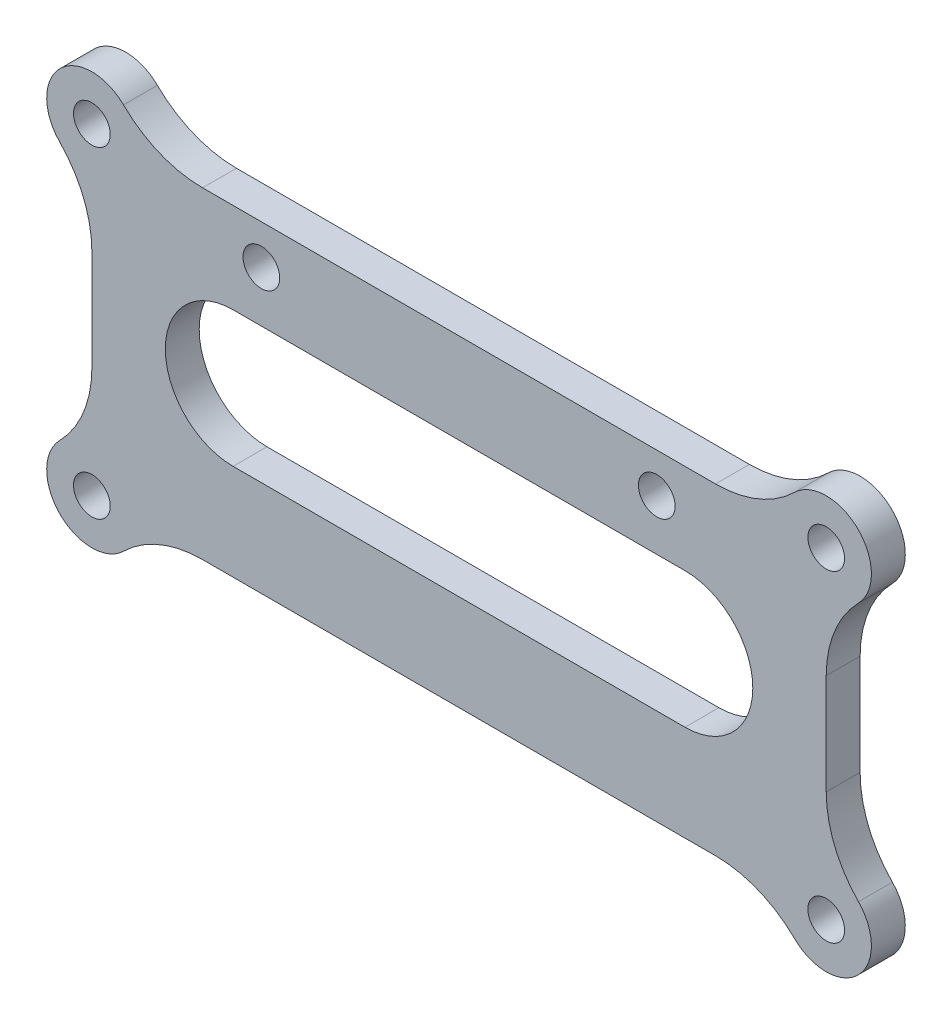
ISO-10303-21;
HEADER;
FILE_DESCRIPTION(('STEP AP214'),'2;1');
FILE_NAME('part.step','',(''),(''),'','','');
FILE_SCHEMA(('AUTOMOTIVE_DESIGN { 1 0 10303 214 1 1 1 1 }'));
ENDSEC;
DATA;
#1=APPLICATION_CONTEXT('core data for automotive mechanical design processes');
#2=APPLICATION_PROTOCOL_DEFINITION('international standard','automotive_design',2000,#1);
#3=PRODUCT_CONTEXT('',#1,'mechanical');
#4=PRODUCT('Part','Part','',(#3));
#5=PRODUCT_RELATED_PRODUCT_CATEGORY('part','',(#4));
#6=PRODUCT_DEFINITION_FORMATION('','',#4);
#7=PRODUCT_DEFINITION_CONTEXT('part definition',#1,'design');
#8=PRODUCT_DEFINITION('design','',#6,#7);
#9=PRODUCT_DEFINITION_SHAPE('','',#8);
#10=(LENGTH_UNIT() NAMED_UNIT(*) SI_UNIT(.MILLI.,.METRE.));
#11=(NAMED_UNIT(*) PLANE_ANGLE_UNIT() SI_UNIT($,.RADIAN.));
#12=(NAMED_UNIT(*) SI_UNIT($,.STERADIAN.) SOLID_ANGLE_UNIT());
#13=UNCERTAINTY_MEASURE_WITH_UNIT(LENGTH_MEASURE(1.E-05),#10,'distance_accuracy_value','');
#14=(GEOMETRIC_REPRESENTATION_CONTEXT(3) GLOBAL_UNCERTAINTY_ASSIGNED_CONTEXT((#13)) GLOBAL_UNIT_ASSIGNED_CONTEXT((#10,
#11,#12)) REPRESENTATION_CONTEXT('',''));
#15=CARTESIAN_POINT('',(0.,0.,0.));
#16=DIRECTION('',(0.,0.,1.));
#17=DIRECTION('',(1.,0.,0.));
#18=AXIS2_PLACEMENT_3D('',#15,#16,#17);
#19=CARTESIAN_POINT('',(32.4999999999997,0.,3.));
#20=DIRECTION('',(0.,0.,-1.));
#21=DIRECTION('',(-1.,0.,0.));
#22=AXIS2_PLACEMENT_3D('',#19,#20,#21);
#23=CYLINDRICAL_SURFACE('',#22,4.);
#24=CARTESIAN_POINT('',(32.4999999999997,0.,0.));
#25=DIRECTION('',(0.,0.,1.));
#26=DIRECTION('',(1.,0.,0.));
#27=AXIS2_PLACEMENT_3D('',#24,#25,#26);
#28=CIRCLE('',#27,4.);
#29=CARTESIAN_POINT('',(29.7005831511047,-2.85714285714286,0.));
#30=VERTEX_POINT('',#29);
#31=CARTESIAN_POINT('',(35.3571428571425,2.79941684889509,0.));
#32=VERTEX_POINT('',#31);
#33=EDGE_CURVE('E213',#30,#32,#28,.T.);
#34=ORIENTED_EDGE('',*,*,#33,.T.);
#35=DIRECTION('',(0.,0.,-1.));
#36=VECTOR('',#35,1.);
#37=CARTESIAN_POINT('',(35.3571428571425,2.79941684889509,3.));
#38=LINE('',#37,#36);
#39=CARTESIAN_POINT('',(35.3571428571425,2.79941684889509,3.));
#40=VERTEX_POINT('',#39);
#41=EDGE_CURVE('E303',#32,#40,#38,.F.);
#42=ORIENTED_EDGE('',*,*,#41,.T.);
#43=CARTESIAN_POINT('',(32.4999999999997,0.,3.));
#44=DIRECTION('',(0.,0.,1.));
#45=DIRECTION('',(1.,0.,0.));
#46=AXIS2_PLACEMENT_3D('',#43,#44,#45);
#47=CIRCLE('',#46,4.);
#48=CARTESIAN_POINT('',(29.7005831511047,-2.85714285714286,3.));
#49=VERTEX_POINT('',#48);
#50=EDGE_CURVE('E214',#49,#40,#47,.T.);
#51=ORIENTED_EDGE('',*,*,#50,.F.);
#52=DIRECTION('',(0.,0.,-1.));
#53=VECTOR('',#52,1.);
#54=CARTESIAN_POINT('',(29.7005831511047,-2.85714285714286,3.));
#55=LINE('',#54,#53);
#56=EDGE_CURVE('E300',#49,#30,#55,.T.);
#57=ORIENTED_EDGE('',*,*,#56,.T.);
#58=EDGE_LOOP('',(#34,#42,#51,#57));
#59=FACE_BOUND('',#58,.T.);
#60=ADVANCED_FACE('F36',(#59),#23,.T.);
#61=CARTESIAN_POINT('',(32.4999999999997,3.95638687503479E-13,3.));
#62=DIRECTION('',(-1.,0.,0.));
#63=DIRECTION('',(0.,-1.,0.));
#64=AXIS2_PLACEMENT_3D('',#61,#62,#63);
#65=PLANE('',#64);
#66=DIRECTION('',(0.,1.,0.));
#67=VECTOR('',#66,1.);
#68=CARTESIAN_POINT('',(32.4999999999997,3.95638687503479E-13,3.));
#69=LINE('',#68,#67);
#70=CARTESIAN_POINT('',(32.4999999999996,9.79795897113271,3.));
#71=VERTEX_POINT('',#70);
#72=CARTESIAN_POINT('',(32.4999999999995,18.7020410288673,3.));
#73=VERTEX_POINT('',#72);
#74=EDGE_CURVE('E217',#71,#73,#69,.T.);
#75=ORIENTED_EDGE('',*,*,#74,.F.);
#76=DIRECTION('',(0.,0.,1.));
#77=VECTOR('',#76,1.);
#78=CARTESIAN_POINT('',(32.4999999999996,9.79795897113271,0.));
#79=LINE('',#78,#77);
#80=CARTESIAN_POINT('',(32.4999999999996,9.79795897113271,0.));
#81=VERTEX_POINT('',#80);
#82=EDGE_CURVE('E297',#71,#81,#79,.F.);
#83=ORIENTED_EDGE('',*,*,#82,.T.);
#84=DIRECTION('',(0.,1.,0.));
#85=VECTOR('',#84,1.);
#86=CARTESIAN_POINT('',(32.4999999999997,3.95638687503479E-13,0.));
#87=LINE('',#86,#85);
#88=CARTESIAN_POINT('',(32.4999999999995,18.7020410288673,0.));
#89=VERTEX_POINT('',#88);
#90=EDGE_CURVE('E254',#81,#89,#87,.T.);
#91=ORIENTED_EDGE('',*,*,#90,.T.);
#92=DIRECTION('',(0.,0.,1.));
#93=VECTOR('',#92,1.);
#94=CARTESIAN_POINT('',(32.4999999999995,18.7020410288673,3.));
#95=LINE('',#94,#93);
#96=EDGE_CURVE('E295',#89,#73,#95,.T.);
#97=ORIENTED_EDGE('',*,*,#96,.T.);
#98=EDGE_LOOP('',(#75,#83,#91,#97));
#99=FACE_BOUND('',#98,.T.);
#100=ADVANCED_FACE('F380',(#99),#65,.F.);
#101=CARTESIAN_POINT('',(32.4999999999994,28.5,3.));
#102=DIRECTION('',(0.,0.,-1.));
#103=DIRECTION('',(-1.,0.,0.));
#104=AXIS2_PLACEMENT_3D('',#101,#102,#103);
#105=CYLINDRICAL_SURFACE('',#104,4.);
#106=CARTESIAN_POINT('',(32.4999999999994,28.5,0.));
#107=DIRECTION('',(0.,0.,1.));
#108=DIRECTION('',(1.,0.,0.));
#109=AXIS2_PLACEMENT_3D('',#106,#107,#108);
#110=CIRCLE('',#109,4.);
#111=CARTESIAN_POINT('',(35.3571428571423,25.700583151105,0.));
#112=VERTEX_POINT('',#111);
#113=CARTESIAN_POINT('',(29.7005831511043,31.3571428571429,0.));
#114=VERTEX_POINT('',#113);
#115=EDGE_CURVE('E257',#112,#114,#110,.T.);
#116=ORIENTED_EDGE('',*,*,#115,.T.);
#117=DIRECTION('',(0.,0.,-1.));
#118=VECTOR('',#117,1.);
#119=CARTESIAN_POINT('',(29.7005831511043,31.3571428571429,3.));
#120=LINE('',#119,#118);
#121=CARTESIAN_POINT('',(29.7005831511043,31.3571428571429,3.));
#122=VERTEX_POINT('',#121);
#123=EDGE_CURVE('E323',#114,#122,#120,.F.);
#124=ORIENTED_EDGE('',*,*,#123,.T.);
#125=CARTESIAN_POINT('',(32.4999999999994,28.5,3.));
#126=DIRECTION('',(0.,0.,1.));
#127=DIRECTION('',(1.,0.,0.));
#128=AXIS2_PLACEMENT_3D('',#125,#126,#127);
#129=CIRCLE('',#128,4.);
#130=CARTESIAN_POINT('',(35.3571428571423,25.700583151105,3.));
#131=VERTEX_POINT('',#130);
#132=EDGE_CURVE('E221',#131,#122,#129,.T.);
#133=ORIENTED_EDGE('',*,*,#132,.F.);
#134=DIRECTION('',(0.,0.,-1.));
#135=VECTOR('',#134,1.);
#136=CARTESIAN_POINT('',(35.3571428571423,25.700583151105,3.));
#137=LINE('',#136,#135);
#138=EDGE_CURVE('E320',#131,#112,#137,.T.);
#139=ORIENTED_EDGE('',*,*,#138,.T.);
#140=EDGE_LOOP('',(#116,#124,#133,#139));
#141=FACE_BOUND('',#140,.T.);
#142=ADVANCED_FACE('F386',(#141),#105,.T.);
#143=CARTESIAN_POINT('',(0.,28.5,3.));
#144=DIRECTION('',(0.,1.,0.));
#145=DIRECTION('',(-1.,0.,0.));
#146=AXIS2_PLACEMENT_3D('',#143,#144,#145);
#147=PLANE('',#146);
#148=DIRECTION('',(1.,0.,0.));
#149=VECTOR('',#148,1.);
#150=CARTESIAN_POINT('',(0.,28.5,0.));
#151=LINE('',#150,#149);
#152=CARTESIAN_POINT('',(-22.7020410288676,28.5,0.));
#153=VERTEX_POINT('',#152);
#154=CARTESIAN_POINT('',(22.7020410288667,28.5,0.));
#155=VERTEX_POINT('',#154);
#156=EDGE_CURVE('E260',#153,#155,#151,.T.);
#157=ORIENTED_EDGE('',*,*,#156,.F.);
#158=DIRECTION('',(0.,0.,-1.));
#159=VECTOR('',#158,1.);
#160=CARTESIAN_POINT('',(-22.7020410288676,28.5,3.));
#161=LINE('',#160,#159);
#162=CARTESIAN_POINT('',(-22.7020410288676,28.5,3.));
#163=VERTEX_POINT('',#162);
#164=EDGE_CURVE('E318',#153,#163,#161,.F.);
#165=ORIENTED_EDGE('',*,*,#164,.T.);
#166=DIRECTION('',(1.,0.,0.));
#167=VECTOR('',#166,1.);
#168=CARTESIAN_POINT('',(0.,28.5,3.));
#169=LINE('',#168,#167);
#170=CARTESIAN_POINT('',(22.7020410288667,28.5,3.));
#171=VERTEX_POINT('',#170);
#172=EDGE_CURVE('E224',#163,#171,#169,.T.);
#173=ORIENTED_EDGE('',*,*,#172,.T.);
#174=DIRECTION('',(0.,0.,-1.));
#175=VECTOR('',#174,1.);
#176=CARTESIAN_POINT('',(22.7020410288667,28.5,3.));
#177=LINE('',#176,#175);
#178=EDGE_CURVE('E315',#171,#155,#177,.T.);
#179=ORIENTED_EDGE('',*,*,#178,.T.);
#180=EDGE_LOOP('',(#157,#165,#173,#179));
#181=FACE_BOUND('',#180,.T.);
#182=ADVANCED_FACE('F431',(#181),#147,.T.);
#183=CARTESIAN_POINT('',(-32.5000000000003,28.5,3.));
#184=DIRECTION('',(0.,0.,-1.));
#185=DIRECTION('',(-1.,0.,0.));
#186=AXIS2_PLACEMENT_3D('',#183,#184,#185);
#187=CYLINDRICAL_SURFACE('',#186,4.);
#188=CARTESIAN_POINT('',(-32.5000000000003,28.5,0.));
#189=DIRECTION('',(0.,0.,1.));
#190=DIRECTION('',(1.,0.,0.));
#191=AXIS2_PLACEMENT_3D('',#188,#189,#190);
#192=CIRCLE('',#191,4.);
#193=CARTESIAN_POINT('',(-29.7005831511053,31.3571428571429,0.));
#194=VERTEX_POINT('',#193);
#195=CARTESIAN_POINT('',(-35.3571428571431,25.7005831511049,0.));
#196=VERTEX_POINT('',#195);
#197=EDGE_CURVE('E263',#194,#196,#192,.T.);
#198=ORIENTED_EDGE('',*,*,#197,.T.);
#199=DIRECTION('',(0.,0.,-1.));
#200=VECTOR('',#199,1.);
#201=CARTESIAN_POINT('',(-35.3571428571431,25.7005831511049,3.));
#202=LINE('',#201,#200);
#203=CARTESIAN_POINT('',(-35.3571428571431,25.7005831511049,3.));
#204=VERTEX_POINT('',#203);
#205=EDGE_CURVE('E293',#196,#204,#202,.F.);
#206=ORIENTED_EDGE('',*,*,#205,.T.);
#207=CARTESIAN_POINT('',(-32.5000000000003,28.5,3.));
#208=DIRECTION('',(0.,0.,1.));
#209=DIRECTION('',(1.,0.,0.));
#210=AXIS2_PLACEMENT_3D('',#207,#208,#209);
#211=CIRCLE('',#210,4.);
#212=CARTESIAN_POINT('',(-29.7005831511053,31.3571428571429,3.));
#213=VERTEX_POINT('',#212);
#214=EDGE_CURVE('E227',#213,#204,#211,.T.);
#215=ORIENTED_EDGE('',*,*,#214,.F.);
#216=DIRECTION('',(0.,0.,-1.));
#217=VECTOR('',#216,1.);
#218=CARTESIAN_POINT('',(-29.7005831511053,31.3571428571429,3.));
#219=LINE('',#218,#217);
#220=EDGE_CURVE('E290',#213,#194,#219,.T.);
#221=ORIENTED_EDGE('',*,*,#220,.T.);
#222=EDGE_LOOP('',(#198,#206,#215,#221));
#223=FACE_BOUND('',#222,.T.);
#224=ADVANCED_FACE('F437',(#223),#187,.T.);
#225=CARTESIAN_POINT('',(-32.4999999999999,-5.14330293754525E-13,3.));
#226=DIRECTION('',(-1.,0.,0.));
#227=DIRECTION('',(0.,-1.,0.));
#228=AXIS2_PLACEMENT_3D('',#225,#226,#227);
#229=PLANE('',#228);
#230=DIRECTION('',(0.,1.,0.));
#231=VECTOR('',#230,1.);
#232=CARTESIAN_POINT('',(-32.4999999999999,-5.14330293754525E-13,3.));
#233=LINE('',#232,#231);
#234=CARTESIAN_POINT('',(-32.5,9.79795897113271,3.));
#235=VERTEX_POINT('',#234);
#236=CARTESIAN_POINT('',(-32.5000000000002,18.7020410288673,3.));
#237=VERTEX_POINT('',#236);
#238=EDGE_CURVE('E230',#235,#237,#233,.T.);
#239=ORIENTED_EDGE('',*,*,#238,.T.);
#240=DIRECTION('',(0.,0.,-1.));
#241=VECTOR('',#240,1.);
#242=CARTESIAN_POINT('',(-32.5000000000002,18.7020410288673,3.));
#243=LINE('',#242,#241);
#244=CARTESIAN_POINT('',(-32.5000000000002,18.7020410288673,0.));
#245=VERTEX_POINT('',#244);
#246=EDGE_CURVE('E287',#237,#245,#243,.T.);
#247=ORIENTED_EDGE('',*,*,#246,.T.);
#248=DIRECTION('',(0.,1.,0.));
#249=VECTOR('',#248,1.);
#250=CARTESIAN_POINT('',(-32.4999999999999,-5.14330293754525E-13,0.));
#251=LINE('',#250,#249);
#252=CARTESIAN_POINT('',(-32.5,9.79795897113271,0.));
#253=VERTEX_POINT('',#252);
#254=EDGE_CURVE('E266',#253,#245,#251,.T.);
#255=ORIENTED_EDGE('',*,*,#254,.F.);
#256=DIRECTION('',(0.,0.,-1.));
#257=VECTOR('',#256,1.);
#258=CARTESIAN_POINT('',(-32.5,9.79795897113271,3.));
#259=LINE('',#258,#257);
#260=EDGE_CURVE('E251',#253,#235,#259,.F.);
#261=ORIENTED_EDGE('',*,*,#260,.T.);
#262=EDGE_LOOP('',(#239,#247,#255,#261));
#263=FACE_BOUND('',#262,.T.);
#264=ADVANCED_FACE('F444',(#263),#229,.T.);
#265=CARTESIAN_POINT('',(-32.4999999999999,0.,3.));
#266=DIRECTION('',(0.,0.,-1.));
#267=DIRECTION('',(-1.,0.,0.));
#268=AXIS2_PLACEMENT_3D('',#265,#266,#267);
#269=CYLINDRICAL_SURFACE('',#268,4.);
#270=CARTESIAN_POINT('',(-32.4999999999999,0.,0.));
#271=DIRECTION('',(0.,0.,1.));
#272=DIRECTION('',(1.,0.,0.));
#273=AXIS2_PLACEMENT_3D('',#270,#271,#272);
#274=CIRCLE('',#273,4.);
#275=CARTESIAN_POINT('',(-35.3571428571428,2.79941684889502,0.));
#276=VERTEX_POINT('',#275);
#277=CARTESIAN_POINT('',(-29.7005831511048,-2.85714285714286,0.));
#278=VERTEX_POINT('',#277);
#279=EDGE_CURVE('E269',#276,#278,#274,.T.);
#280=ORIENTED_EDGE('',*,*,#279,.T.);
#281=DIRECTION('',(0.,0.,-1.));
#282=VECTOR('',#281,1.);
#283=CARTESIAN_POINT('',(-29.7005831511048,-2.85714285714286,3.));
#284=LINE('',#283,#282);
#285=CARTESIAN_POINT('',(-29.7005831511048,-2.85714285714286,3.));
#286=VERTEX_POINT('',#285);
#287=EDGE_CURVE('E313',#278,#286,#284,.F.);
#288=ORIENTED_EDGE('',*,*,#287,.T.);
#289=CARTESIAN_POINT('',(-32.4999999999999,0.,3.));
#290=DIRECTION('',(0.,0.,1.));
#291=DIRECTION('',(1.,0.,0.));
#292=AXIS2_PLACEMENT_3D('',#289,#290,#291);
#293=CIRCLE('',#292,4.);
#294=CARTESIAN_POINT('',(-35.3571428571428,2.79941684889502,3.));
#295=VERTEX_POINT('',#294);
#296=EDGE_CURVE('E233',#295,#286,#293,.T.);
#297=ORIENTED_EDGE('',*,*,#296,.F.);
#298=DIRECTION('',(0.,0.,-1.));
#299=VECTOR('',#298,1.);
#300=CARTESIAN_POINT('',(-35.3571428571428,2.79941684889502,3.));
#301=LINE('',#300,#299);
#302=EDGE_CURVE('E310',#295,#276,#301,.T.);
#303=ORIENTED_EDGE('',*,*,#302,.T.);
#304=EDGE_LOOP('',(#280,#288,#297,#303));
#305=FACE_BOUND('',#304,.T.);
#306=ADVANCED_FACE('F451',(#305),#269,.T.);
#307=CARTESIAN_POINT('',(-32.5000000000003,28.5,3.));
#308=DIRECTION('',(0.,0.,-1.));
#309=DIRECTION('',(-1.,0.,0.));
#310=AXIS2_PLACEMENT_3D('',#307,#308,#309);
#311=CYLINDRICAL_SURFACE('',#310,1.62500000000004);
#312=CARTESIAN_POINT('',(-32.5000000000003,28.5,3.));
#313=DIRECTION('',(0.,0.,1.));
#314=DIRECTION('',(1.,0.,0.));
#315=AXIS2_PLACEMENT_3D('',#312,#313,#314);
#316=CIRCLE('',#315,1.62500000000004);
#317=CARTESIAN_POINT('',(-30.8750000000003,28.5,3.));
#318=VERTEX_POINT('',#317);
#319=EDGE_CURVE('E245',#318,#318,#316,.T.);
#320=ORIENTED_EDGE('',*,*,#319,.T.);
#321=EDGE_LOOP('',(#320));
#322=FACE_BOUND('',#321,.T.);
#323=CARTESIAN_POINT('',(-32.5000000000003,28.5,0.));
#324=DIRECTION('',(0.,0.,1.));
#325=DIRECTION('',(1.,0.,0.));
#326=AXIS2_PLACEMENT_3D('',#323,#324,#325);
#327=CIRCLE('',#326,1.62500000000004);
#328=CARTESIAN_POINT('',(-30.8750000000003,28.5,0.));
#329=VERTEX_POINT('',#328);
#330=EDGE_CURVE('E281',#329,#329,#327,.T.);
#331=ORIENTED_EDGE('',*,*,#330,.F.);
#332=EDGE_LOOP('',(#331));
#333=FACE_BOUND('',#332,.T.);
#334=ADVANCED_FACE('F498',(#322,#333),#311,.F.);
#335=CARTESIAN_POINT('',(32.4999999999997,0.,3.));
#336=DIRECTION('',(0.,0.,-1.));
#337=DIRECTION('',(-1.,0.,0.));
#338=AXIS2_PLACEMENT_3D('',#335,#336,#337);
#339=CYLINDRICAL_SURFACE('',#338,1.625);
#340=CARTESIAN_POINT('',(32.4999999999997,0.,3.));
#341=DIRECTION('',(0.,0.,1.));
#342=DIRECTION('',(1.,0.,0.));
#343=AXIS2_PLACEMENT_3D('',#340,#341,#342);
#344=CIRCLE('',#343,1.625);
#345=CARTESIAN_POINT('',(34.1249999999997,0.,3.));
#346=VERTEX_POINT('',#345);
#347=EDGE_CURVE('E242',#346,#346,#344,.T.);
#348=ORIENTED_EDGE('',*,*,#347,.T.);
#349=EDGE_LOOP('',(#348));
#350=FACE_BOUND('',#349,.T.);
#351=CARTESIAN_POINT('',(32.4999999999997,0.,0.));
#352=DIRECTION('',(0.,0.,1.));
#353=DIRECTION('',(1.,0.,0.));
#354=AXIS2_PLACEMENT_3D('',#351,#352,#353);
#355=CIRCLE('',#354,1.625);
#356=CARTESIAN_POINT('',(34.1249999999997,0.,0.));
#357=VERTEX_POINT('',#356);
#358=EDGE_CURVE('E278',#357,#357,#355,.T.);
#359=ORIENTED_EDGE('',*,*,#358,.F.);
#360=EDGE_LOOP('',(#359));
#361=FACE_BOUND('',#360,.T.);
#362=ADVANCED_FACE('F501',(#350,#361),#339,.F.);
#363=CARTESIAN_POINT('',(32.4999999999994,28.5,3.));
#364=DIRECTION('',(0.,0.,-1.));
#365=DIRECTION('',(-1.,0.,0.));
#366=AXIS2_PLACEMENT_3D('',#363,#364,#365);
#367=CYLINDRICAL_SURFACE('',#366,1.625);
#368=CARTESIAN_POINT('',(32.4999999999994,28.5,3.));
#369=DIRECTION('',(0.,0.,1.));
#370=DIRECTION('',(1.,0.,0.));
#371=AXIS2_PLACEMENT_3D('',#368,#369,#370);
#372=CIRCLE('',#371,1.625);
#373=CARTESIAN_POINT('',(34.1249999999994,28.5,3.));
#374=VERTEX_POINT('',#373);
#375=EDGE_CURVE('E239',#374,#374,#372,.T.);
#376=ORIENTED_EDGE('',*,*,#375,.T.);
#377=EDGE_LOOP('',(#376));
#378=FACE_BOUND('',#377,.T.);
#379=CARTESIAN_POINT('',(32.4999999999994,28.5,0.));
#380=DIRECTION('',(0.,0.,1.));
#381=DIRECTION('',(1.,0.,0.));
#382=AXIS2_PLACEMENT_3D('',#379,#380,#381);
#383=CIRCLE('',#382,1.625);
#384=CARTESIAN_POINT('',(34.1249999999994,28.5,0.));
#385=VERTEX_POINT('',#384);
#386=EDGE_CURVE('E275',#385,#385,#383,.T.);
#387=ORIENTED_EDGE('',*,*,#386,.F.);
#388=EDGE_LOOP('',(#387));
#389=FACE_BOUND('',#388,.T.);
#390=ADVANCED_FACE('F495',(#378,#389),#367,.F.);
#391=CARTESIAN_POINT('',(0.,0.,3.));
#392=DIRECTION('',(0.,1.,0.));
#393=DIRECTION('',(0.,0.,1.));
#394=AXIS2_PLACEMENT_3D('',#391,#392,#393);
#395=PLANE('',#394);
#396=DIRECTION('',(1.,0.,0.));
#397=VECTOR('',#396,1.);
#398=CARTESIAN_POINT('',(0.,0.,0.));
#399=LINE('',#398,#397);
#400=CARTESIAN_POINT('',(-22.7020410288672,0.,0.));
#401=VERTEX_POINT('',#400);
#402=CARTESIAN_POINT('',(22.702041028867,0.,0.));
#403=VERTEX_POINT('',#402);
#404=EDGE_CURVE('E272',#401,#403,#399,.T.);
#405=ORIENTED_EDGE('',*,*,#404,.T.);
#406=DIRECTION('',(0.,0.,1.));
#407=VECTOR('',#406,1.);
#408=CARTESIAN_POINT('',(22.702041028867,0.,3.));
#409=LINE('',#408,#407);
#410=CARTESIAN_POINT('',(22.702041028867,0.,3.));
#411=VERTEX_POINT('',#410);
#412=EDGE_CURVE('E308',#403,#411,#409,.T.);
#413=ORIENTED_EDGE('',*,*,#412,.T.);
#414=DIRECTION('',(1.,0.,0.));
#415=VECTOR('',#414,1.);
#416=CARTESIAN_POINT('',(0.,0.,3.));
#417=LINE('',#416,#415);
#418=CARTESIAN_POINT('',(-22.7020410288672,0.,3.));
#419=VERTEX_POINT('',#418);
#420=EDGE_CURVE('E236',#419,#411,#417,.T.);
#421=ORIENTED_EDGE('',*,*,#420,.F.);
#422=DIRECTION('',(0.,0.,1.));
#423=VECTOR('',#422,1.);
#424=CARTESIAN_POINT('',(-22.7020410288672,0.,0.));
#425=LINE('',#424,#423);
#426=EDGE_CURVE('E305',#419,#401,#425,.F.);
#427=ORIENTED_EDGE('',*,*,#426,.T.);
#428=EDGE_LOOP('',(#405,#413,#421,#427));
#429=FACE_BOUND('',#428,.T.);
#430=ADVANCED_FACE('F458',(#429),#395,.F.);
#431=CARTESIAN_POINT('',(-32.4999999999999,0.,3.));
#432=DIRECTION('',(0.,0.,-1.));
#433=DIRECTION('',(-1.,0.,0.));
#434=AXIS2_PLACEMENT_3D('',#431,#432,#433);
#435=CYLINDRICAL_SURFACE('',#434,1.625);
#436=CARTESIAN_POINT('',(-32.4999999999999,0.,3.));
#437=DIRECTION('',(0.,0.,1.));
#438=DIRECTION('',(1.,0.,0.));
#439=AXIS2_PLACEMENT_3D('',#436,#437,#438);
#440=CIRCLE('',#439,1.625);
#441=CARTESIAN_POINT('',(-30.8749999999999,0.,3.));
#442=VERTEX_POINT('',#441);
#443=EDGE_CURVE('E248',#442,#442,#440,.T.);
#444=ORIENTED_EDGE('',*,*,#443,.T.);
#445=EDGE_LOOP('',(#444));
#446=FACE_BOUND('',#445,.T.);
#447=CARTESIAN_POINT('',(-32.4999999999999,0.,0.));
#448=DIRECTION('',(0.,0.,1.));
#449=DIRECTION('',(1.,0.,0.));
#450=AXIS2_PLACEMENT_3D('',#447,#448,#449);
#451=CIRCLE('',#450,1.625);
#452=CARTESIAN_POINT('',(-30.8749999999999,0.,0.));
#453=VERTEX_POINT('',#452);
#454=EDGE_CURVE('E218',#453,#453,#451,.T.);
#455=ORIENTED_EDGE('',*,*,#454,.F.);
#456=EDGE_LOOP('',(#455));
#457=FACE_BOUND('',#456,.T.);
#458=ADVANCED_FACE('F486',(#446,#457),#435,.F.);
#459=CARTESIAN_POINT('',(0.,0.,3.));
#460=DIRECTION('',(0.,0.,1.));
#461=DIRECTION('',(1.,0.,0.));
#462=AXIS2_PLACEMENT_3D('',#459,#460,#461);
#463=PLANE('',#462);
#464=CARTESIAN_POINT('',(-20.,14.5,3.));
#465=DIRECTION('',(0.,0.,1.));
#466=DIRECTION('',(1.,0.,0.));
#467=AXIS2_PLACEMENT_3D('',#464,#465,#466);
#468=CIRCLE('',#467,6.);
#469=CARTESIAN_POINT('',(-20.,20.5,3.));
#470=VERTEX_POINT('',#469);
#471=CARTESIAN_POINT('',(-20.,8.5,3.));
#472=VERTEX_POINT('',#471);
#473=EDGE_CURVE('E51',#470,#472,#468,.T.);
#474=ORIENTED_EDGE('',*,*,#473,.F.);
#475=DIRECTION('',(-1.,0.,0.));
#476=VECTOR('',#475,1.);
#477=CARTESIAN_POINT('',(-20.,20.5,3.));
#478=LINE('',#477,#476);
#479=CARTESIAN_POINT('',(20.,20.5,3.));
#480=VERTEX_POINT('',#479);
#481=EDGE_CURVE('E192',#480,#470,#478,.T.);
#482=ORIENTED_EDGE('',*,*,#481,.F.);
#483=CARTESIAN_POINT('',(20.,14.5,3.));
#484=DIRECTION('',(0.,0.,1.));
#485=DIRECTION('',(1.,0.,0.));
#486=AXIS2_PLACEMENT_3D('',#483,#484,#485);
#487=CIRCLE('',#486,6.);
#488=CARTESIAN_POINT('',(20.,8.50000000000001,3.));
#489=VERTEX_POINT('',#488);
#490=EDGE_CURVE('E176',#489,#480,#487,.T.);
#491=ORIENTED_EDGE('',*,*,#490,.F.);
#492=DIRECTION('',(1.,0.,0.));
#493=VECTOR('',#492,1.);
#494=CARTESIAN_POINT('',(-20.,8.5,3.));
#495=LINE('',#494,#493);
#496=EDGE_CURVE('E185',#472,#489,#495,.T.);
#497=ORIENTED_EDGE('',*,*,#496,.F.);
#498=EDGE_LOOP('',(#474,#482,#491,#497));
#499=FACE_BOUND('',#498,.T.);
#500=CARTESIAN_POINT('',(17.5,25.,3.));
#501=DIRECTION('',(0.,0.,1.));
#502=DIRECTION('',(1.,0.,0.));
#503=AXIS2_PLACEMENT_3D('',#500,#501,#502);
#504=CIRCLE('',#503,1.625);
#505=CARTESIAN_POINT('',(19.125,25.,3.));
#506=VERTEX_POINT('',#505);
#507=EDGE_CURVE('E210',#506,#506,#504,.T.);
#508=ORIENTED_EDGE('',*,*,#507,.F.);
#509=EDGE_LOOP('',(#508));
#510=FACE_BOUND('',#509,.T.);
#511=CARTESIAN_POINT('',(-17.5,25.,3.));
#512=DIRECTION('',(0.,0.,1.));
#513=DIRECTION('',(1.,0.,0.));
#514=AXIS2_PLACEMENT_3D('',#511,#512,#513);
#515=CIRCLE('',#514,1.625);
#516=CARTESIAN_POINT('',(-15.875,25.,3.));
#517=VERTEX_POINT('',#516);
#518=EDGE_CURVE('E205',#517,#517,#515,.T.);
#519=ORIENTED_EDGE('',*,*,#518,.F.);
#520=EDGE_LOOP('',(#519));
#521=FACE_BOUND('',#520,.T.);
#522=ORIENTED_EDGE('',*,*,#420,.T.);
#523=CARTESIAN_POINT('',(22.702041028867,-10.,3.));
#524=DIRECTION('',(0.,0.,1.));
#525=DIRECTION('',(1.,0.,0.));
#526=AXIS2_PLACEMENT_3D('',#523,#524,#525);
#527=CIRCLE('',#526,10.);
#528=EDGE_CURVE('E335',#411,#49,#527,.F.);
#529=ORIENTED_EDGE('',*,*,#528,.T.);
#530=ORIENTED_EDGE('',*,*,#50,.T.);
#531=CARTESIAN_POINT('',(42.4999999999996,9.79795897113283,3.));
#532=DIRECTION('',(0.,0.,1.));
#533=DIRECTION('',(1.,0.,0.));
#534=AXIS2_PLACEMENT_3D('',#531,#532,#533);
#535=CIRCLE('',#534,10.);
#536=EDGE_CURVE('E331',#40,#71,#535,.F.);
#537=ORIENTED_EDGE('',*,*,#536,.T.);
#538=ORIENTED_EDGE('',*,*,#74,.T.);
#539=CARTESIAN_POINT('',(42.4999999999995,18.7020410288674,3.));
#540=DIRECTION('',(0.,0.,1.));
#541=DIRECTION('',(1.,0.,0.));
#542=AXIS2_PLACEMENT_3D('',#539,#540,#541);
#543=CIRCLE('',#542,10.);
#544=EDGE_CURVE('E355',#73,#131,#543,.F.);
#545=ORIENTED_EDGE('',*,*,#544,.T.);
#546=ORIENTED_EDGE('',*,*,#132,.T.);
#547=CARTESIAN_POINT('',(22.7020410288667,38.5,3.));
#548=DIRECTION('',(0.,0.,1.));
#549=DIRECTION('',(1.,0.,0.));
#550=AXIS2_PLACEMENT_3D('',#547,#548,#549);
#551=CIRCLE('',#550,10.);
#552=EDGE_CURVE('E351',#122,#171,#551,.F.);
#553=ORIENTED_EDGE('',*,*,#552,.T.);
#554=ORIENTED_EDGE('',*,*,#172,.F.);
#555=CARTESIAN_POINT('',(-22.7020410288676,38.5,3.));
#556=DIRECTION('',(0.,0.,1.));
#557=DIRECTION('',(1.,0.,0.));
#558=AXIS2_PLACEMENT_3D('',#555,#556,#557);
#559=CIRCLE('',#558,10.);
#560=EDGE_CURVE('E347',#163,#213,#559,.F.);
#561=ORIENTED_EDGE('',*,*,#560,.T.);
#562=ORIENTED_EDGE('',*,*,#214,.T.);
#563=CARTESIAN_POINT('',(-42.5000000000002,18.7020410288671,3.));
#564=DIRECTION('',(0.,0.,1.));
#565=DIRECTION('',(1.,0.,0.));
#566=AXIS2_PLACEMENT_3D('',#563,#564,#565);
#567=CIRCLE('',#566,10.);
#568=EDGE_CURVE('E327',#204,#237,#567,.F.);
#569=ORIENTED_EDGE('',*,*,#568,.T.);
#570=ORIENTED_EDGE('',*,*,#238,.F.);
#571=CARTESIAN_POINT('',(-42.5,9.79795897113255,3.));
#572=DIRECTION('',(0.,0.,1.));
#573=DIRECTION('',(1.,0.,0.));
#574=AXIS2_PLACEMENT_3D('',#571,#572,#573);
#575=CIRCLE('',#574,10.);
#576=EDGE_CURVE('E343',#235,#295,#575,.F.);
#577=ORIENTED_EDGE('',*,*,#576,.T.);
#578=ORIENTED_EDGE('',*,*,#296,.T.);
#579=CARTESIAN_POINT('',(-22.7020410288672,-10.,3.));
#580=DIRECTION('',(0.,0.,1.));
#581=DIRECTION('',(1.,0.,0.));
#582=AXIS2_PLACEMENT_3D('',#579,#580,#581);
#583=CIRCLE('',#582,10.);
#584=EDGE_CURVE('E339',#286,#419,#583,.F.);
#585=ORIENTED_EDGE('',*,*,#584,.T.);
#586=EDGE_LOOP('',(#522,#529,#530,#537,#538,#545,#546,#553,#554,#561,#562,#569,#570,#577,#578,#585));
#587=FACE_BOUND('',#586,.T.);
#588=ORIENTED_EDGE('',*,*,#375,.F.);
#589=EDGE_LOOP('',(#588));
#590=FACE_BOUND('',#589,.T.);
#591=ORIENTED_EDGE('',*,*,#347,.F.);
#592=EDGE_LOOP('',(#591));
#593=FACE_BOUND('',#592,.T.);
#594=ORIENTED_EDGE('',*,*,#319,.F.);
#595=EDGE_LOOP('',(#594));
#596=FACE_BOUND('',#595,.T.);
#597=ORIENTED_EDGE('',*,*,#443,.F.);
#598=EDGE_LOOP('',(#597));
#599=FACE_BOUND('',#598,.T.);
#600=ADVANCED_FACE('F189',(#499,#510,#521,#587,#590,#593,#596,#599),#463,.T.);
#601=CARTESIAN_POINT('',(0.,0.,0.));
#602=DIRECTION('',(0.,0.,1.));
#603=DIRECTION('',(1.,0.,0.));
#604=AXIS2_PLACEMENT_3D('',#601,#602,#603);
#605=PLANE('',#604);
#606=DIRECTION('',(-1.,0.,0.));
#607=VECTOR('',#606,1.);
#608=CARTESIAN_POINT('',(0.,20.5,0.));
#609=LINE('',#608,#607);
#610=CARTESIAN_POINT('',(20.,20.5,0.));
#611=VERTEX_POINT('',#610);
#612=CARTESIAN_POINT('',(-20.,20.5,0.));
#613=VERTEX_POINT('',#612);
#614=EDGE_CURVE('E44',#611,#613,#609,.T.);
#615=ORIENTED_EDGE('',*,*,#614,.T.);
#616=CARTESIAN_POINT('',(-20.,14.5,0.));
#617=DIRECTION('',(0.,0.,1.));
#618=DIRECTION('',(1.,0.,0.));
#619=AXIS2_PLACEMENT_3D('',#616,#617,#618);
#620=CIRCLE('',#619,6.);
#621=CARTESIAN_POINT('',(-20.,8.5,0.));
#622=VERTEX_POINT('',#621);
#623=EDGE_CURVE('E11',#613,#622,#620,.T.);
#624=ORIENTED_EDGE('',*,*,#623,.T.);
#625=DIRECTION('',(1.,0.,0.));
#626=VECTOR('',#625,1.);
#627=CARTESIAN_POINT('',(0.,8.50000000000001,0.));
#628=LINE('',#627,#626);
#629=CARTESIAN_POINT('',(20.,8.50000000000001,0.));
#630=VERTEX_POINT('',#629);
#631=EDGE_CURVE('E357',#622,#630,#628,.T.);
#632=ORIENTED_EDGE('',*,*,#631,.T.);
#633=CARTESIAN_POINT('',(20.,14.5,0.));
#634=DIRECTION('',(0.,0.,1.));
#635=DIRECTION('',(1.,0.,0.));
#636=AXIS2_PLACEMENT_3D('',#633,#634,#635);
#637=CIRCLE('',#636,6.);
#638=EDGE_CURVE('E179',#630,#611,#637,.T.);
#639=ORIENTED_EDGE('',*,*,#638,.T.);
#640=EDGE_LOOP('',(#615,#624,#632,#639));
#641=FACE_BOUND('',#640,.T.);
#642=CARTESIAN_POINT('',(17.5,25.,0.));
#643=DIRECTION('',(0.,0.,-1.));
#644=DIRECTION('',(-1.,0.,0.));
#645=AXIS2_PLACEMENT_3D('',#642,#643,#644);
#646=CIRCLE('',#645,1.625);
#647=CARTESIAN_POINT('',(15.875,25.,0.));
#648=VERTEX_POINT('',#647);
#649=EDGE_CURVE('E202',#648,#648,#646,.T.);
#650=ORIENTED_EDGE('',*,*,#649,.F.);
#651=EDGE_LOOP('',(#650));
#652=FACE_BOUND('',#651,.T.);
#653=CARTESIAN_POINT('',(-17.5,25.,0.));
#654=DIRECTION('',(0.,0.,-1.));
#655=DIRECTION('',(1.,0.,0.));
#656=AXIS2_PLACEMENT_3D('',#653,#654,#655);
#657=CIRCLE('',#656,1.625);
#658=CARTESIAN_POINT('',(-15.875,25.,0.));
#659=VERTEX_POINT('',#658);
#660=EDGE_CURVE('E199',#659,#659,#657,.T.);
#661=ORIENTED_EDGE('',*,*,#660,.F.);
#662=EDGE_LOOP('',(#661));
#663=FACE_BOUND('',#662,.T.);
#664=ORIENTED_EDGE('',*,*,#33,.F.);
#665=CARTESIAN_POINT('',(22.702041028867,-10.,0.));
#666=DIRECTION('',(0.,0.,1.));
#667=DIRECTION('',(1.,0.,0.));
#668=AXIS2_PLACEMENT_3D('',#665,#666,#667);
#669=CIRCLE('',#668,10.);
#670=EDGE_CURVE('E333',#30,#403,#669,.T.);
#671=ORIENTED_EDGE('',*,*,#670,.T.);
#672=ORIENTED_EDGE('',*,*,#404,.F.);
#673=CARTESIAN_POINT('',(-22.7020410288672,-10.,0.));
#674=DIRECTION('',(0.,0.,1.));
#675=DIRECTION('',(1.,0.,0.));
#676=AXIS2_PLACEMENT_3D('',#673,#674,#675);
#677=CIRCLE('',#676,10.);
#678=EDGE_CURVE('E337',#401,#278,#677,.T.);
#679=ORIENTED_EDGE('',*,*,#678,.T.);
#680=ORIENTED_EDGE('',*,*,#279,.F.);
#681=CARTESIAN_POINT('',(-42.5,9.79795897113255,0.));
#682=DIRECTION('',(0.,0.,1.));
#683=DIRECTION('',(1.,0.,0.));
#684=AXIS2_PLACEMENT_3D('',#681,#682,#683);
#685=CIRCLE('',#684,10.);
#686=EDGE_CURVE('E341',#276,#253,#685,.T.);
#687=ORIENTED_EDGE('',*,*,#686,.T.);
#688=ORIENTED_EDGE('',*,*,#254,.T.);
#689=CARTESIAN_POINT('',(-42.5000000000002,18.7020410288671,0.));
#690=DIRECTION('',(0.,0.,1.));
#691=DIRECTION('',(1.,0.,0.));
#692=AXIS2_PLACEMENT_3D('',#689,#690,#691);
#693=CIRCLE('',#692,10.);
#694=EDGE_CURVE('E325',#245,#196,#693,.T.);
#695=ORIENTED_EDGE('',*,*,#694,.T.);
#696=ORIENTED_EDGE('',*,*,#197,.F.);
#697=CARTESIAN_POINT('',(-22.7020410288676,38.5,0.));
#698=DIRECTION('',(0.,0.,1.));
#699=DIRECTION('',(1.,0.,0.));
#700=AXIS2_PLACEMENT_3D('',#697,#698,#699);
#701=CIRCLE('',#700,10.);
#702=EDGE_CURVE('E345',#194,#153,#701,.T.);
#703=ORIENTED_EDGE('',*,*,#702,.T.);
#704=ORIENTED_EDGE('',*,*,#156,.T.);
#705=CARTESIAN_POINT('',(22.7020410288667,38.5,0.));
#706=DIRECTION('',(0.,0.,1.));
#707=DIRECTION('',(1.,0.,0.));
#708=AXIS2_PLACEMENT_3D('',#705,#706,#707);
#709=CIRCLE('',#708,10.);
#710=EDGE_CURVE('E349',#155,#114,#709,.T.);
#711=ORIENTED_EDGE('',*,*,#710,.T.);
#712=ORIENTED_EDGE('',*,*,#115,.F.);
#713=CARTESIAN_POINT('',(42.4999999999995,18.7020410288674,0.));
#714=DIRECTION('',(0.,0.,1.));
#715=DIRECTION('',(1.,0.,0.));
#716=AXIS2_PLACEMENT_3D('',#713,#714,#715);
#717=CIRCLE('',#716,10.);
#718=EDGE_CURVE('E353',#112,#89,#717,.T.);
#719=ORIENTED_EDGE('',*,*,#718,.T.);
#720=ORIENTED_EDGE('',*,*,#90,.F.);
#721=CARTESIAN_POINT('',(42.4999999999996,9.79795897113283,0.));
#722=DIRECTION('',(0.,0.,1.));
#723=DIRECTION('',(1.,0.,0.));
#724=AXIS2_PLACEMENT_3D('',#721,#722,#723);
#725=CIRCLE('',#724,10.);
#726=EDGE_CURVE('E329',#81,#32,#725,.T.);
#727=ORIENTED_EDGE('',*,*,#726,.T.);
#728=EDGE_LOOP('',(#664,#671,#672,#679,#680,#687,#688,#695,#696,#703,#704,#711,#712,#719,#720,#727));
#729=FACE_BOUND('',#728,.T.);
#730=ORIENTED_EDGE('',*,*,#386,.T.);
#731=EDGE_LOOP('',(#730));
#732=FACE_BOUND('',#731,.T.);
#733=ORIENTED_EDGE('',*,*,#358,.T.);
#734=EDGE_LOOP('',(#733));
#735=FACE_BOUND('',#734,.T.);
#736=ORIENTED_EDGE('',*,*,#330,.T.);
#737=EDGE_LOOP('',(#736));
#738=FACE_BOUND('',#737,.T.);
#739=ORIENTED_EDGE('',*,*,#454,.T.);
#740=EDGE_LOOP('',(#739));
#741=FACE_BOUND('',#740,.T.);
#742=ADVANCED_FACE('F361',(#641,#652,#663,#729,#732,#735,#738,#741),#605,.F.);
#743=CARTESIAN_POINT('',(-42.5000000000002,18.7020410288671,3.));
#744=DIRECTION('',(0.,0.,-1.));
#745=DIRECTION('',(-1.,0.,0.));
#746=AXIS2_PLACEMENT_3D('',#743,#744,#745);
#747=CYLINDRICAL_SURFACE('',#746,10.);
#748=ORIENTED_EDGE('',*,*,#568,.F.);
#749=ORIENTED_EDGE('',*,*,#205,.F.);
#750=ORIENTED_EDGE('',*,*,#694,.F.);
#751=ORIENTED_EDGE('',*,*,#246,.F.);
#752=EDGE_LOOP('',(#748,#749,#750,#751));
#753=FACE_BOUND('',#752,.T.);
#754=ADVANCED_FACE('F391',(#753),#747,.F.);
#755=CARTESIAN_POINT('',(42.4999999999996,9.79795897113283,3.));
#756=DIRECTION('',(0.,0.,-1.));
#757=DIRECTION('',(-1.,0.,0.));
#758=AXIS2_PLACEMENT_3D('',#755,#756,#757);
#759=CYLINDRICAL_SURFACE('',#758,10.);
#760=ORIENTED_EDGE('',*,*,#536,.F.);
#761=ORIENTED_EDGE('',*,*,#41,.F.);
#762=ORIENTED_EDGE('',*,*,#726,.F.);
#763=ORIENTED_EDGE('',*,*,#82,.F.);
#764=EDGE_LOOP('',(#760,#761,#762,#763));
#765=FACE_BOUND('',#764,.T.);
#766=ADVANCED_FACE('F394',(#765),#759,.F.);
#767=CARTESIAN_POINT('',(22.702041028867,-10.,3.));
#768=DIRECTION('',(0.,0.,-1.));
#769=DIRECTION('',(-1.,0.,0.));
#770=AXIS2_PLACEMENT_3D('',#767,#768,#769);
#771=CYLINDRICAL_SURFACE('',#770,10.);
#772=ORIENTED_EDGE('',*,*,#528,.F.);
#773=ORIENTED_EDGE('',*,*,#412,.F.);
#774=ORIENTED_EDGE('',*,*,#670,.F.);
#775=ORIENTED_EDGE('',*,*,#56,.F.);
#776=EDGE_LOOP('',(#772,#773,#774,#775));
#777=FACE_BOUND('',#776,.T.);
#778=ADVANCED_FACE('F398',(#777),#771,.F.);
#779=CARTESIAN_POINT('',(-22.7020410288672,-10.,3.));
#780=DIRECTION('',(0.,0.,-1.));
#781=DIRECTION('',(-1.,0.,0.));
#782=AXIS2_PLACEMENT_3D('',#779,#780,#781);
#783=CYLINDRICAL_SURFACE('',#782,10.);
#784=ORIENTED_EDGE('',*,*,#584,.F.);
#785=ORIENTED_EDGE('',*,*,#287,.F.);
#786=ORIENTED_EDGE('',*,*,#678,.F.);
#787=ORIENTED_EDGE('',*,*,#426,.F.);
#788=EDGE_LOOP('',(#784,#785,#786,#787));
#789=FACE_BOUND('',#788,.T.);
#790=ADVANCED_FACE('F402',(#789),#783,.F.);
#791=CARTESIAN_POINT('',(-42.5,9.79795897113255,3.));
#792=DIRECTION('',(0.,0.,-1.));
#793=DIRECTION('',(-1.,0.,0.));
#794=AXIS2_PLACEMENT_3D('',#791,#792,#793);
#795=CYLINDRICAL_SURFACE('',#794,10.);
#796=ORIENTED_EDGE('',*,*,#576,.F.);
#797=ORIENTED_EDGE('',*,*,#260,.F.);
#798=ORIENTED_EDGE('',*,*,#686,.F.);
#799=ORIENTED_EDGE('',*,*,#302,.F.);
#800=EDGE_LOOP('',(#796,#797,#798,#799));
#801=FACE_BOUND('',#800,.T.);
#802=ADVANCED_FACE('F406',(#801),#795,.F.);
#803=CARTESIAN_POINT('',(-22.7020410288676,38.5,3.));
#804=DIRECTION('',(0.,0.,-1.));
#805=DIRECTION('',(-1.,0.,0.));
#806=AXIS2_PLACEMENT_3D('',#803,#804,#805);
#807=CYLINDRICAL_SURFACE('',#806,10.);
#808=ORIENTED_EDGE('',*,*,#560,.F.);
#809=ORIENTED_EDGE('',*,*,#164,.F.);
#810=ORIENTED_EDGE('',*,*,#702,.F.);
#811=ORIENTED_EDGE('',*,*,#220,.F.);
#812=EDGE_LOOP('',(#808,#809,#810,#811));
#813=FACE_BOUND('',#812,.T.);
#814=ADVANCED_FACE('F410',(#813),#807,.F.);
#815=CARTESIAN_POINT('',(22.7020410288667,38.5,3.));
#816=DIRECTION('',(0.,0.,-1.));
#817=DIRECTION('',(-1.,0.,0.));
#818=AXIS2_PLACEMENT_3D('',#815,#816,#817);
#819=CYLINDRICAL_SURFACE('',#818,10.);
#820=ORIENTED_EDGE('',*,*,#552,.F.);
#821=ORIENTED_EDGE('',*,*,#123,.F.);
#822=ORIENTED_EDGE('',*,*,#710,.F.);
#823=ORIENTED_EDGE('',*,*,#178,.F.);
#824=EDGE_LOOP('',(#820,#821,#822,#823));
#825=FACE_BOUND('',#824,.T.);
#826=ADVANCED_FACE('F413',(#825),#819,.F.);
#827=CARTESIAN_POINT('',(42.4999999999995,18.7020410288674,3.));
#828=DIRECTION('',(0.,0.,-1.));
#829=DIRECTION('',(-1.,0.,0.));
#830=AXIS2_PLACEMENT_3D('',#827,#828,#829);
#831=CYLINDRICAL_SURFACE('',#830,10.);
#832=ORIENTED_EDGE('',*,*,#544,.F.);
#833=ORIENTED_EDGE('',*,*,#96,.F.);
#834=ORIENTED_EDGE('',*,*,#718,.F.);
#835=ORIENTED_EDGE('',*,*,#138,.F.);
#836=EDGE_LOOP('',(#832,#833,#834,#835));
#837=FACE_BOUND('',#836,.T.);
#838=ADVANCED_FACE('F38',(#837),#831,.F.);
#839=CARTESIAN_POINT('',(-17.5,25.,10.));
#840=DIRECTION('',(0.,0.,-1.));
#841=DIRECTION('',(-1.,0.,0.));
#842=AXIS2_PLACEMENT_3D('',#839,#840,#841);
#843=CYLINDRICAL_SURFACE('',#842,1.625);
#844=ORIENTED_EDGE('',*,*,#518,.T.);
#845=EDGE_LOOP('',(#844));
#846=FACE_BOUND('',#845,.T.);
#847=ORIENTED_EDGE('',*,*,#660,.T.);
#848=EDGE_LOOP('',(#847));
#849=FACE_BOUND('',#848,.T.);
#850=ADVANCED_FACE('F375',(#846,#849),#843,.F.);
#851=CARTESIAN_POINT('',(17.5,25.,10.));
#852=DIRECTION('',(0.,0.,-1.));
#853=DIRECTION('',(-1.,0.,0.));
#854=AXIS2_PLACEMENT_3D('',#851,#852,#853);
#855=CYLINDRICAL_SURFACE('',#854,1.625);
#856=ORIENTED_EDGE('',*,*,#507,.T.);
#857=EDGE_LOOP('',(#856));
#858=FACE_BOUND('',#857,.T.);
#859=ORIENTED_EDGE('',*,*,#649,.T.);
#860=EDGE_LOOP('',(#859));
#861=FACE_BOUND('',#860,.T.);
#862=ADVANCED_FACE('F368',(#858,#861),#855,.F.);
#863=CARTESIAN_POINT('',(-20.,14.5,-7.));
#864=DIRECTION('',(0.,0.,1.));
#865=DIRECTION('',(1.,0.,0.));
#866=AXIS2_PLACEMENT_3D('',#863,#864,#865);
#867=CYLINDRICAL_SURFACE('',#866,6.);
#868=DIRECTION('',(0.,0.,1.));
#869=VECTOR('',#868,1.);
#870=CARTESIAN_POINT('',(-20.,20.5,-7.));
#871=LINE('',#870,#869);
#872=EDGE_CURVE('E197',#613,#470,#871,.T.);
#873=ORIENTED_EDGE('',*,*,#872,.T.);
#874=ORIENTED_EDGE('',*,*,#473,.T.);
#875=DIRECTION('',(0.,0.,1.));
#876=VECTOR('',#875,1.);
#877=CARTESIAN_POINT('',(-20.,8.5,-7.));
#878=LINE('',#877,#876);
#879=EDGE_CURVE('E182',#622,#472,#878,.T.);
#880=ORIENTED_EDGE('',*,*,#879,.F.);
#881=ORIENTED_EDGE('',*,*,#623,.F.);
#882=EDGE_LOOP('',(#873,#874,#880,#881));
#883=FACE_BOUND('',#882,.T.);
#884=ADVANCED_FACE('F366',(#883),#867,.F.);
#885=CARTESIAN_POINT('',(-20.,20.5,-7.));
#886=DIRECTION('',(0.,1.,0.));
#887=DIRECTION('',(-1.,0.,0.));
#888=AXIS2_PLACEMENT_3D('',#885,#886,#887);
#889=PLANE('',#888);
#890=DIRECTION('',(0.,0.,1.));
#891=VECTOR('',#890,1.);
#892=CARTESIAN_POINT('',(20.,20.5,-7.));
#893=LINE('',#892,#891);
#894=EDGE_CURVE('E181',#611,#480,#893,.T.);
#895=ORIENTED_EDGE('',*,*,#894,.T.);
#896=ORIENTED_EDGE('',*,*,#481,.T.);
#897=ORIENTED_EDGE('',*,*,#872,.F.);
#898=ORIENTED_EDGE('',*,*,#614,.F.);
#899=EDGE_LOOP('',(#895,#896,#897,#898));
#900=FACE_BOUND('',#899,.T.);
#901=ADVANCED_FACE('F365',(#900),#889,.F.);
#902=CARTESIAN_POINT('',(20.,14.5,-7.));
#903=DIRECTION('',(0.,0.,1.));
#904=DIRECTION('',(1.,0.,0.));
#905=AXIS2_PLACEMENT_3D('',#902,#903,#904);
#906=CYLINDRICAL_SURFACE('',#905,6.);
#907=DIRECTION('',(0.,0.,1.));
#908=VECTOR('',#907,1.);
#909=CARTESIAN_POINT('',(20.,8.50000000000001,-7.));
#910=LINE('',#909,#908);
#911=EDGE_CURVE('E59',#630,#489,#910,.T.);
#912=ORIENTED_EDGE('',*,*,#911,.T.);
#913=ORIENTED_EDGE('',*,*,#490,.T.);
#914=ORIENTED_EDGE('',*,*,#894,.F.);
#915=ORIENTED_EDGE('',*,*,#638,.F.);
#916=EDGE_LOOP('',(#912,#913,#914,#915));
#917=FACE_BOUND('',#916,.T.);
#918=ADVANCED_FACE('F173',(#917),#906,.F.);
#919=CARTESIAN_POINT('',(-20.,8.5,-7.));
#920=DIRECTION('',(0.,-1.,0.));
#921=DIRECTION('',(1.,0.,0.));
#922=AXIS2_PLACEMENT_3D('',#919,#920,#921);
#923=PLANE('',#922);
#924=ORIENTED_EDGE('',*,*,#879,.T.);
#925=ORIENTED_EDGE('',*,*,#496,.T.);
#926=ORIENTED_EDGE('',*,*,#911,.F.);
#927=ORIENTED_EDGE('',*,*,#631,.F.);
#928=EDGE_LOOP('',(#924,#925,#926,#927));
#929=FACE_BOUND('',#928,.T.);
#930=ADVANCED_FACE('F186',(#929),#923,.F.);
#931=CLOSED_SHELL('',(#60,#100,#142,#182,#224,#264,#306,#334,#362,#390,#430,#458,#600,#742,#754,
#766,#778,#790,#802,#814,#826,#838,#850,#862,#884,#901,#918,#930));
#932=MANIFOLD_SOLID_BREP('B2',#931);
#933=ADVANCED_BREP_SHAPE_REPRESENTATION('',(#18,#932),#14);
#934=SHAPE_DEFINITION_REPRESENTATION(#9,#933);
ENDSEC;
END-ISO-10303-21;
